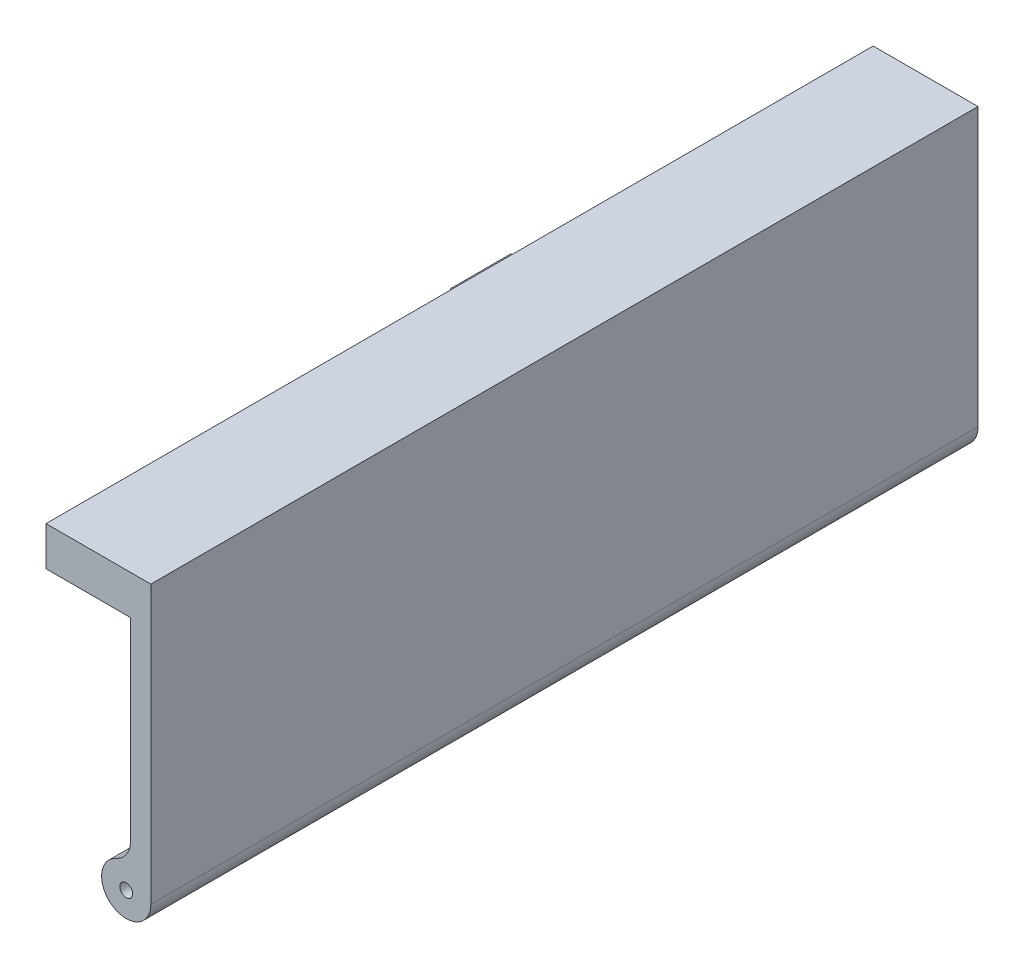
ISO-10303-21;
HEADER;
FILE_DESCRIPTION(('STEP AP214'),'2;1');
FILE_NAME('part.step','',(''),(''),'','','');
FILE_SCHEMA(('AUTOMOTIVE_DESIGN { 1 0 10303 214 1 1 1 1 }'));
ENDSEC;
DATA;
#1=APPLICATION_CONTEXT('core data for automotive mechanical design processes');
#2=APPLICATION_PROTOCOL_DEFINITION('international standard','automotive_design',2000,#1);
#3=PRODUCT_CONTEXT('',#1,'mechanical');
#4=PRODUCT('Part','Part','',(#3));
#5=PRODUCT_RELATED_PRODUCT_CATEGORY('part','',(#4));
#6=PRODUCT_DEFINITION_FORMATION('','',#4);
#7=PRODUCT_DEFINITION_CONTEXT('part definition',#1,'design');
#8=PRODUCT_DEFINITION('design','',#6,#7);
#9=PRODUCT_DEFINITION_SHAPE('','',#8);
#10=(LENGTH_UNIT() NAMED_UNIT(*) SI_UNIT(.MILLI.,.METRE.));
#11=(NAMED_UNIT(*) PLANE_ANGLE_UNIT() SI_UNIT($,.RADIAN.));
#12=(NAMED_UNIT(*) SI_UNIT($,.STERADIAN.) SOLID_ANGLE_UNIT());
#13=UNCERTAINTY_MEASURE_WITH_UNIT(LENGTH_MEASURE(1.E-05),#10,'distance_accuracy_value','');
#14=(GEOMETRIC_REPRESENTATION_CONTEXT(3) GLOBAL_UNCERTAINTY_ASSIGNED_CONTEXT((#13)) GLOBAL_UNIT_ASSIGNED_CONTEXT((#10,
#11,#12)) REPRESENTATION_CONTEXT('',''));
#15=CARTESIAN_POINT('',(0.,0.,0.));
#16=DIRECTION('',(0.,0.,1.));
#17=DIRECTION('',(1.,0.,0.));
#18=AXIS2_PLACEMENT_3D('',#15,#16,#17);
#19=CARTESIAN_POINT('',(-7.95,0.,0.));
#20=DIRECTION('',(1.,0.,0.));
#21=DIRECTION('',(0.,0.,-1.));
#22=AXIS2_PLACEMENT_3D('',#19,#20,#21);
#23=PLANE('',#22);
#24=DIRECTION('',(0.,1.,0.));
#25=VECTOR('',#24,1.);
#26=CARTESIAN_POINT('',(-7.95,23.619265905383,39.9228321400159));
#27=LINE('',#26,#25);
#28=CARTESIAN_POINT('',(-7.95,23.619265905383,39.9228321400159));
#29=VERTEX_POINT('',#28);
#30=CARTESIAN_POINT('',(-7.95,25.619265905383,39.9228321400159));
#31=VERTEX_POINT('',#30);
#32=EDGE_CURVE('E136',#29,#31,#27,.T.);
#33=ORIENTED_EDGE('',*,*,#32,.F.);
#34=DIRECTION('',(0.,0.,1.));
#35=VECTOR('',#34,1.);
#36=CARTESIAN_POINT('',(-7.95,23.619265905383,82.));
#37=LINE('',#36,#35);
#38=CARTESIAN_POINT('',(-7.95,23.619265905383,82.));
#39=VERTEX_POINT('',#38);
#40=EDGE_CURVE('E164',#29,#39,#37,.T.);
#41=ORIENTED_EDGE('',*,*,#40,.T.);
#42=DIRECTION('',(0.,1.,0.));
#43=VECTOR('',#42,1.);
#44=CARTESIAN_POINT('',(-7.95,27.5,82.));
#45=LINE('',#44,#43);
#46=CARTESIAN_POINT('',(-7.95,27.5,82.));
#47=VERTEX_POINT('',#46);
#48=EDGE_CURVE('E160',#39,#47,#45,.T.);
#49=ORIENTED_EDGE('',*,*,#48,.T.);
#50=DIRECTION('',(0.,0.,-1.));
#51=VECTOR('',#50,1.);
#52=CARTESIAN_POINT('',(-7.95,27.5,82.));
#53=LINE('',#52,#51);
#54=CARTESIAN_POINT('',(-7.95,27.5,0.));
#55=VERTEX_POINT('',#54);
#56=EDGE_CURVE('E163',#47,#55,#53,.T.);
#57=ORIENTED_EDGE('',*,*,#56,.T.);
#58=DIRECTION('',(0.,-1.,0.));
#59=VECTOR('',#58,1.);
#60=CARTESIAN_POINT('',(-7.95,27.5,0.));
#61=LINE('',#60,#59);
#62=CARTESIAN_POINT('',(-7.95,23.619265905383,0.));
#63=VERTEX_POINT('',#62);
#64=EDGE_CURVE('E167',#55,#63,#61,.T.);
#65=ORIENTED_EDGE('',*,*,#64,.T.);
#66=CARTESIAN_POINT('',(-7.95,23.619265905383,33.9228321400159));
#67=VERTEX_POINT('',#66);
#68=EDGE_CURVE('E169',#63,#67,#37,.T.);
#69=ORIENTED_EDGE('',*,*,#68,.T.);
#70=DIRECTION('',(0.,-1.,0.));
#71=VECTOR('',#70,1.);
#72=CARTESIAN_POINT('',(-7.95,23.619265905383,33.9228321400159));
#73=LINE('',#72,#71);
#74=CARTESIAN_POINT('',(-7.95,25.619265905383,33.9228321400159));
#75=VERTEX_POINT('',#74);
#76=EDGE_CURVE('E51',#75,#67,#73,.T.);
#77=ORIENTED_EDGE('',*,*,#76,.F.);
#78=DIRECTION('',(0.,0.,-1.));
#79=VECTOR('',#78,1.);
#80=CARTESIAN_POINT('',(-7.95,25.619265905383,39.9228321400159));
#81=LINE('',#80,#79);
#82=EDGE_CURVE('E152',#31,#75,#81,.T.);
#83=ORIENTED_EDGE('',*,*,#82,.F.);
#84=EDGE_LOOP('',(#33,#41,#49,#57,#65,#69,#77,#83));
#85=FACE_BOUND('',#84,.T.);
#86=ADVANCED_FACE('F47',(#85),#23,.F.);
#87=CARTESIAN_POINT('',(0.44,4.48998886412873,82.));
#88=DIRECTION('',(1.,0.,0.));
#89=DIRECTION('',(0.,0.,-1.));
#90=AXIS2_PLACEMENT_3D('',#87,#88,#89);
#91=PLANE('',#90);
#92=DIRECTION('',(0.,0.,1.));
#93=VECTOR('',#92,1.);
#94=CARTESIAN_POINT('',(0.44,23.619265905383,82.));
#95=LINE('',#94,#93);
#96=CARTESIAN_POINT('',(0.44,23.619265905383,0.));
#97=VERTEX_POINT('',#96);
#98=CARTESIAN_POINT('',(0.44,23.619265905383,82.));
#99=VERTEX_POINT('',#98);
#100=EDGE_CURVE('E149',#97,#99,#95,.T.);
#101=ORIENTED_EDGE('',*,*,#100,.F.);
#102=DIRECTION('',(0.,-1.,0.));
#103=VECTOR('',#102,1.);
#104=CARTESIAN_POINT('',(0.44,4.48998886412873,0.));
#105=LINE('',#104,#103);
#106=CARTESIAN_POINT('',(0.44,4.48998886412873,0.));
#107=VERTEX_POINT('',#106);
#108=EDGE_CURVE('E171',#97,#107,#105,.T.);
#109=ORIENTED_EDGE('',*,*,#108,.T.);
#110=DIRECTION('',(0.,0.,-1.));
#111=VECTOR('',#110,1.);
#112=CARTESIAN_POINT('',(0.44,4.48998886412873,82.));
#113=LINE('',#112,#111);
#114=CARTESIAN_POINT('',(0.44,4.48998886412873,82.));
#115=VERTEX_POINT('',#114);
#116=EDGE_CURVE('E191',#115,#107,#113,.T.);
#117=ORIENTED_EDGE('',*,*,#116,.F.);
#118=DIRECTION('',(0.,-1.,0.));
#119=VECTOR('',#118,1.);
#120=CARTESIAN_POINT('',(0.44,4.48998886412873,82.));
#121=LINE('',#120,#119);
#122=EDGE_CURVE('E177',#99,#115,#121,.T.);
#123=ORIENTED_EDGE('',*,*,#122,.F.);
#124=EDGE_LOOP('',(#101,#109,#117,#123));
#125=FACE_BOUND('',#124,.T.);
#126=ADVANCED_FACE('F249',(#125),#91,.F.);
#127=CARTESIAN_POINT('',(0.,0.,82.));
#128=DIRECTION('',(0.,0.,1.));
#129=DIRECTION('',(1.,0.,0.));
#130=AXIS2_PLACEMENT_3D('',#127,#128,#129);
#131=PLANE('',#130);
#132=CARTESIAN_POINT('',(0.,0.,82.));
#133=DIRECTION('',(0.,0.,1.));
#134=DIRECTION('',(1.,0.,0.));
#135=AXIS2_PLACEMENT_3D('',#132,#133,#134);
#136=CIRCLE('',#135,2.44);
#137=CARTESIAN_POINT('',(-1.01748987854251,2.21772729321338,82.));
#138=VERTEX_POINT('',#137);
#139=CARTESIAN_POINT('',(2.44,0.,82.));
#140=VERTEX_POINT('',#139);
#141=EDGE_CURVE('E197',#138,#140,#136,.T.);
#142=ORIENTED_EDGE('',*,*,#141,.T.);
#143=DIRECTION('',(0.,1.,0.));
#144=VECTOR('',#143,1.);
#145=CARTESIAN_POINT('',(2.44,0.,82.));
#146=LINE('',#145,#144);
#147=CARTESIAN_POINT('',(2.44,27.5,82.));
#148=VERTEX_POINT('',#147);
#149=EDGE_CURVE('E178',#140,#148,#146,.T.);
#150=ORIENTED_EDGE('',*,*,#149,.T.);
#151=DIRECTION('',(1.,0.,0.));
#152=VECTOR('',#151,1.);
#153=CARTESIAN_POINT('',(0.44,27.5,82.));
#154=LINE('',#153,#152);
#155=EDGE_CURVE('E181',#47,#148,#154,.T.);
#156=ORIENTED_EDGE('',*,*,#155,.F.);
#157=ORIENTED_EDGE('',*,*,#48,.F.);
#158=DIRECTION('',(1.,0.,0.));
#159=VECTOR('',#158,1.);
#160=CARTESIAN_POINT('',(-7.95,23.619265905383,82.));
#161=LINE('',#160,#159);
#162=EDGE_CURVE('E174',#39,#99,#161,.T.);
#163=ORIENTED_EDGE('',*,*,#162,.T.);
#164=ORIENTED_EDGE('',*,*,#122,.T.);
#165=CARTESIAN_POINT('',(-2.06,4.48998886412873,82.));
#166=DIRECTION('',(0.,0.,-1.));
#167=DIRECTION('',(-1.,0.,0.));
#168=AXIS2_PLACEMENT_3D('',#165,#166,#167);
#169=CIRCLE('',#168,2.5);
#170=EDGE_CURVE('E196',#115,#138,#169,.T.);
#171=ORIENTED_EDGE('',*,*,#170,.T.);
#172=EDGE_LOOP('',(#142,#150,#156,#157,#163,#164,#171));
#173=FACE_BOUND('',#172,.T.);
#174=CARTESIAN_POINT('',(0.,0.,82.));
#175=DIRECTION('',(0.,0.,1.));
#176=DIRECTION('',(1.,0.,0.));
#177=AXIS2_PLACEMENT_3D('',#174,#175,#176);
#178=CIRCLE('',#177,0.64);
#179=CARTESIAN_POINT('',(0.64,0.,82.));
#180=VERTEX_POINT('',#179);
#181=EDGE_CURVE('E188',#180,#180,#178,.T.);
#182=ORIENTED_EDGE('',*,*,#181,.F.);
#183=EDGE_LOOP('',(#182));
#184=FACE_BOUND('',#183,.T.);
#185=ADVANCED_FACE('F240',(#173,#184),#131,.T.);
#186=CARTESIAN_POINT('',(0.,0.,0.));
#187=DIRECTION('',(0.,0.,1.));
#188=DIRECTION('',(1.,0.,0.));
#189=AXIS2_PLACEMENT_3D('',#186,#187,#188);
#190=PLANE('',#189);
#191=CARTESIAN_POINT('',(0.,0.,0.));
#192=DIRECTION('',(0.,0.,1.));
#193=DIRECTION('',(1.,0.,0.));
#194=AXIS2_PLACEMENT_3D('',#191,#192,#193);
#195=CIRCLE('',#194,2.44);
#196=CARTESIAN_POINT('',(-1.01748987854251,2.21772729321338,0.));
#197=VERTEX_POINT('',#196);
#198=CARTESIAN_POINT('',(2.44,0.,0.));
#199=VERTEX_POINT('',#198);
#200=EDGE_CURVE('E195',#197,#199,#195,.T.);
#201=ORIENTED_EDGE('',*,*,#200,.F.);
#202=CARTESIAN_POINT('',(-2.06,4.48998886412873,0.));
#203=DIRECTION('',(0.,0.,-1.));
#204=DIRECTION('',(-1.,0.,0.));
#205=AXIS2_PLACEMENT_3D('',#202,#203,#204);
#206=CIRCLE('',#205,2.5);
#207=EDGE_CURVE('E210',#107,#197,#206,.T.);
#208=ORIENTED_EDGE('',*,*,#207,.F.);
#209=ORIENTED_EDGE('',*,*,#108,.F.);
#210=DIRECTION('',(1.,0.,0.));
#211=VECTOR('',#210,1.);
#212=CARTESIAN_POINT('',(-7.95,23.619265905383,0.));
#213=LINE('',#212,#211);
#214=EDGE_CURVE('E173',#63,#97,#213,.T.);
#215=ORIENTED_EDGE('',*,*,#214,.F.);
#216=ORIENTED_EDGE('',*,*,#64,.F.);
#217=DIRECTION('',(-1.,0.,0.));
#218=VECTOR('',#217,1.);
#219=CARTESIAN_POINT('',(0.44,27.5,0.));
#220=LINE('',#219,#218);
#221=CARTESIAN_POINT('',(2.44,27.5,0.));
#222=VERTEX_POINT('',#221);
#223=EDGE_CURVE('E184',#222,#55,#220,.T.);
#224=ORIENTED_EDGE('',*,*,#223,.F.);
#225=DIRECTION('',(0.,1.,0.));
#226=VECTOR('',#225,1.);
#227=CARTESIAN_POINT('',(2.44,0.,0.));
#228=LINE('',#227,#226);
#229=EDGE_CURVE('E206',#199,#222,#228,.T.);
#230=ORIENTED_EDGE('',*,*,#229,.F.);
#231=EDGE_LOOP('',(#201,#208,#209,#215,#216,#224,#230));
#232=FACE_BOUND('',#231,.T.);
#233=CARTESIAN_POINT('',(0.,0.,0.));
#234=DIRECTION('',(0.,0.,1.));
#235=DIRECTION('',(1.,0.,0.));
#236=AXIS2_PLACEMENT_3D('',#233,#234,#235);
#237=CIRCLE('',#236,0.64);
#238=CARTESIAN_POINT('',(0.64,0.,0.));
#239=VERTEX_POINT('',#238);
#240=EDGE_CURVE('E192',#239,#239,#237,.T.);
#241=ORIENTED_EDGE('',*,*,#240,.T.);
#242=EDGE_LOOP('',(#241));
#243=FACE_BOUND('',#242,.T.);
#244=ADVANCED_FACE('F228',(#232,#243),#190,.F.);
#245=CARTESIAN_POINT('',(0.,0.,82.));
#246=DIRECTION('',(0.,0.,-1.));
#247=DIRECTION('',(-1.,0.,0.));
#248=AXIS2_PLACEMENT_3D('',#245,#246,#247);
#249=CYLINDRICAL_SURFACE('',#248,2.44);
#250=ORIENTED_EDGE('',*,*,#200,.T.);
#251=DIRECTION('',(0.,0.,-1.));
#252=VECTOR('',#251,1.);
#253=CARTESIAN_POINT('',(2.44,0.,82.));
#254=LINE('',#253,#252);
#255=EDGE_CURVE('E208',#140,#199,#254,.T.);
#256=ORIENTED_EDGE('',*,*,#255,.F.);
#257=ORIENTED_EDGE('',*,*,#141,.F.);
#258=DIRECTION('',(0.,0.,-1.));
#259=VECTOR('',#258,1.);
#260=CARTESIAN_POINT('',(-1.01748987854251,2.21772729321338,82.));
#261=LINE('',#260,#259);
#262=EDGE_CURVE('E205',#138,#197,#261,.T.);
#263=ORIENTED_EDGE('',*,*,#262,.T.);
#264=EDGE_LOOP('',(#250,#256,#257,#263));
#265=FACE_BOUND('',#264,.T.);
#266=ADVANCED_FACE('F224',(#265),#249,.T.);
#267=CARTESIAN_POINT('',(2.44,0.,82.));
#268=DIRECTION('',(-1.,0.,0.));
#269=DIRECTION('',(0.,0.,1.));
#270=AXIS2_PLACEMENT_3D('',#267,#268,#269);
#271=PLANE('',#270);
#272=ORIENTED_EDGE('',*,*,#229,.T.);
#273=DIRECTION('',(0.,0.,-1.));
#274=VECTOR('',#273,1.);
#275=CARTESIAN_POINT('',(2.44,27.5,82.));
#276=LINE('',#275,#274);
#277=EDGE_CURVE('E180',#148,#222,#276,.T.);
#278=ORIENTED_EDGE('',*,*,#277,.F.);
#279=ORIENTED_EDGE('',*,*,#149,.F.);
#280=ORIENTED_EDGE('',*,*,#255,.T.);
#281=EDGE_LOOP('',(#272,#278,#279,#280));
#282=FACE_BOUND('',#281,.T.);
#283=ADVANCED_FACE('F219',(#282),#271,.F.);
#284=CARTESIAN_POINT('',(-2.06,4.48998886412873,82.));
#285=DIRECTION('',(0.,0.,-1.));
#286=DIRECTION('',(-1.,0.,0.));
#287=AXIS2_PLACEMENT_3D('',#284,#285,#286);
#288=CYLINDRICAL_SURFACE('',#287,2.5);
#289=ORIENTED_EDGE('',*,*,#207,.T.);
#290=ORIENTED_EDGE('',*,*,#262,.F.);
#291=ORIENTED_EDGE('',*,*,#170,.F.);
#292=ORIENTED_EDGE('',*,*,#116,.T.);
#293=EDGE_LOOP('',(#289,#290,#291,#292));
#294=FACE_BOUND('',#293,.T.);
#295=ADVANCED_FACE('F246',(#294),#288,.F.);
#296=CARTESIAN_POINT('',(0.,0.,82.));
#297=DIRECTION('',(0.,0.,-1.));
#298=DIRECTION('',(-1.,0.,0.));
#299=AXIS2_PLACEMENT_3D('',#296,#297,#298);
#300=CYLINDRICAL_SURFACE('',#299,0.64);
#301=ORIENTED_EDGE('',*,*,#181,.T.);
#302=EDGE_LOOP('',(#301));
#303=FACE_BOUND('',#302,.T.);
#304=ORIENTED_EDGE('',*,*,#240,.F.);
#305=EDGE_LOOP('',(#304));
#306=FACE_BOUND('',#305,.T.);
#307=ADVANCED_FACE('F271',(#303,#306),#300,.F.);
#308=CARTESIAN_POINT('',(0.,27.5,0.));
#309=DIRECTION('',(0.,-1.,0.));
#310=DIRECTION('',(0.,0.,-1.));
#311=AXIS2_PLACEMENT_3D('',#308,#309,#310);
#312=PLANE('',#311);
#313=ORIENTED_EDGE('',*,*,#223,.T.);
#314=ORIENTED_EDGE('',*,*,#56,.F.);
#315=ORIENTED_EDGE('',*,*,#155,.T.);
#316=ORIENTED_EDGE('',*,*,#277,.T.);
#317=EDGE_LOOP('',(#313,#314,#315,#316));
#318=FACE_BOUND('',#317,.T.);
#319=ADVANCED_FACE('F236',(#318),#312,.F.);
#320=CARTESIAN_POINT('',(-7.95,23.619265905383,82.));
#321=DIRECTION('',(0.,1.,0.));
#322=DIRECTION('',(0.,0.,1.));
#323=AXIS2_PLACEMENT_3D('',#320,#321,#322);
#324=PLANE('',#323);
#325=ORIENTED_EDGE('',*,*,#40,.F.);
#326=DIRECTION('',(-1.,0.,0.));
#327=VECTOR('',#326,1.);
#328=CARTESIAN_POINT('',(-7.95,23.619265905383,39.9228321400159));
#329=LINE('',#328,#327);
#330=CARTESIAN_POINT('',(-5.95,23.619265905383,39.9228321400159));
#331=VERTEX_POINT('',#330);
#332=EDGE_CURVE('E146',#331,#29,#329,.T.);
#333=ORIENTED_EDGE('',*,*,#332,.F.);
#334=DIRECTION('',(0.,0.,1.));
#335=VECTOR('',#334,1.);
#336=CARTESIAN_POINT('',(-5.95,23.619265905383,33.9228321400159));
#337=LINE('',#336,#335);
#338=CARTESIAN_POINT('',(-5.95,23.619265905383,33.9228321400159));
#339=VERTEX_POINT('',#338);
#340=EDGE_CURVE('E132',#339,#331,#337,.T.);
#341=ORIENTED_EDGE('',*,*,#340,.F.);
#342=DIRECTION('',(1.,0.,0.));
#343=VECTOR('',#342,1.);
#344=CARTESIAN_POINT('',(-7.95,23.619265905383,33.9228321400159));
#345=LINE('',#344,#343);
#346=EDGE_CURVE('E155',#67,#339,#345,.T.);
#347=ORIENTED_EDGE('',*,*,#346,.F.);
#348=ORIENTED_EDGE('',*,*,#68,.F.);
#349=ORIENTED_EDGE('',*,*,#214,.T.);
#350=ORIENTED_EDGE('',*,*,#100,.T.);
#351=ORIENTED_EDGE('',*,*,#162,.F.);
#352=EDGE_LOOP('',(#325,#333,#341,#347,#348,#349,#350,#351));
#353=FACE_BOUND('',#352,.T.);
#354=ADVANCED_FACE('F49',(#353),#324,.F.);
#355=CARTESIAN_POINT('',(-7.95,25.619265905383,39.9228321400159));
#356=DIRECTION('',(0.,0.,1.));
#357=DIRECTION('',(1.,0.,0.));
#358=AXIS2_PLACEMENT_3D('',#355,#356,#357);
#359=PLANE('',#358);
#360=ORIENTED_EDGE('',*,*,#332,.T.);
#361=ORIENTED_EDGE('',*,*,#32,.T.);
#362=DIRECTION('',(-1.,0.,0.));
#363=VECTOR('',#362,1.);
#364=CARTESIAN_POINT('',(-7.95,25.619265905383,39.9228321400159));
#365=LINE('',#364,#363);
#366=CARTESIAN_POINT('',(-5.95,25.619265905383,39.9228321400159));
#367=VERTEX_POINT('',#366);
#368=EDGE_CURVE('E12',#367,#31,#365,.T.);
#369=ORIENTED_EDGE('',*,*,#368,.F.);
#370=DIRECTION('',(0.,-1.,0.));
#371=VECTOR('',#370,1.);
#372=CARTESIAN_POINT('',(-5.95,25.619265905383,39.9228321400159));
#373=LINE('',#372,#371);
#374=EDGE_CURVE('E127',#367,#331,#373,.T.);
#375=ORIENTED_EDGE('',*,*,#374,.T.);
#376=EDGE_LOOP('',(#360,#361,#369,#375));
#377=FACE_BOUND('',#376,.T.);
#378=ADVANCED_FACE('F144',(#377),#359,.F.);
#379=CARTESIAN_POINT('',(-5.95,25.619265905383,33.9228321400159));
#380=DIRECTION('',(1.,0.,0.));
#381=DIRECTION('',(0.,0.,-1.));
#382=AXIS2_PLACEMENT_3D('',#379,#380,#381);
#383=PLANE('',#382);
#384=ORIENTED_EDGE('',*,*,#340,.T.);
#385=ORIENTED_EDGE('',*,*,#374,.F.);
#386=DIRECTION('',(0.,0.,1.));
#387=VECTOR('',#386,1.);
#388=CARTESIAN_POINT('',(-5.95,25.619265905383,33.9228321400159));
#389=LINE('',#388,#387);
#390=CARTESIAN_POINT('',(-5.95,25.619265905383,33.9228321400159));
#391=VERTEX_POINT('',#390);
#392=EDGE_CURVE('E57',#391,#367,#389,.T.);
#393=ORIENTED_EDGE('',*,*,#392,.F.);
#394=DIRECTION('',(0.,-1.,0.));
#395=VECTOR('',#394,1.);
#396=CARTESIAN_POINT('',(-5.95,25.619265905383,33.9228321400159));
#397=LINE('',#396,#395);
#398=EDGE_CURVE('E157',#391,#339,#397,.T.);
#399=ORIENTED_EDGE('',*,*,#398,.T.);
#400=EDGE_LOOP('',(#384,#385,#393,#399));
#401=FACE_BOUND('',#400,.T.);
#402=ADVANCED_FACE('F129',(#401),#383,.F.);
#403=CARTESIAN_POINT('',(-7.95,25.619265905383,33.9228321400159));
#404=DIRECTION('',(0.,0.,-1.));
#405=DIRECTION('',(-1.,0.,0.));
#406=AXIS2_PLACEMENT_3D('',#403,#404,#405);
#407=PLANE('',#406);
#408=ORIENTED_EDGE('',*,*,#346,.T.);
#409=ORIENTED_EDGE('',*,*,#398,.F.);
#410=DIRECTION('',(1.,0.,0.));
#411=VECTOR('',#410,1.);
#412=CARTESIAN_POINT('',(-7.95,25.619265905383,33.9228321400159));
#413=LINE('',#412,#411);
#414=EDGE_CURVE('E142',#75,#391,#413,.T.);
#415=ORIENTED_EDGE('',*,*,#414,.F.);
#416=ORIENTED_EDGE('',*,*,#76,.T.);
#417=EDGE_LOOP('',(#408,#409,#415,#416));
#418=FACE_BOUND('',#417,.T.);
#419=ADVANCED_FACE('F254',(#418),#407,.F.);
#420=CARTESIAN_POINT('',(0.,25.619265905383,0.));
#421=DIRECTION('',(0.,1.,0.));
#422=DIRECTION('',(0.,0.,1.));
#423=AXIS2_PLACEMENT_3D('',#420,#421,#422);
#424=PLANE('',#423);
#425=ORIENTED_EDGE('',*,*,#82,.T.);
#426=ORIENTED_EDGE('',*,*,#414,.T.);
#427=ORIENTED_EDGE('',*,*,#392,.T.);
#428=ORIENTED_EDGE('',*,*,#368,.T.);
#429=EDGE_LOOP('',(#425,#426,#427,#428));
#430=FACE_BOUND('',#429,.T.);
#431=ADVANCED_FACE('F140',(#430),#424,.F.);
#432=CLOSED_SHELL('',(#86,#126,#185,#244,#266,#283,#295,#307,#319,#354,#378,#402,#419,#431));
#433=MANIFOLD_SOLID_BREP('B2',#432);
#434=CARTESIAN_POINT('',(-9.95,0.,0.));
#435=DIRECTION('',(-1.,0.,0.));
#436=DIRECTION('',(0.,0.,1.));
#437=AXIS2_PLACEMENT_3D('',#434,#435,#436);
#438=PLANE('',#437);
#439=DIRECTION('',(0.,1.,0.));
#440=VECTOR('',#439,1.);
#441=CARTESIAN_POINT('',(-9.95,23.619265905383,39.9228321400159));
#442=LINE('',#441,#440);
#443=CARTESIAN_POINT('',(-9.95,23.619265905383,39.9228321400159));
#444=VERTEX_POINT('',#443);
#445=CARTESIAN_POINT('',(-9.95,25.619265905383,39.9228321400159));
#446=VERTEX_POINT('',#445);
#447=EDGE_CURVE('E454',#444,#446,#442,.T.);
#448=ORIENTED_EDGE('',*,*,#447,.T.);
#449=DIRECTION('',(0.,0.,-1.));
#450=VECTOR('',#449,1.);
#451=CARTESIAN_POINT('',(-9.95,25.619265905383,39.9228321400159));
#452=LINE('',#451,#450);
#453=CARTESIAN_POINT('',(-9.95,25.619265905383,33.9228321400159));
#454=VERTEX_POINT('',#453);
#455=EDGE_CURVE('E480',#446,#454,#452,.T.);
#456=ORIENTED_EDGE('',*,*,#455,.T.);
#457=DIRECTION('',(0.,-1.,0.));
#458=VECTOR('',#457,1.);
#459=CARTESIAN_POINT('',(-9.95,23.619265905383,33.9228321400159));
#460=LINE('',#459,#458);
#461=CARTESIAN_POINT('',(-9.95,23.619265905383,33.9228321400159));
#462=VERTEX_POINT('',#461);
#463=EDGE_CURVE('E466',#454,#462,#460,.T.);
#464=ORIENTED_EDGE('',*,*,#463,.T.);
#465=DIRECTION('',(0.,0.,1.));
#466=VECTOR('',#465,1.);
#467=CARTESIAN_POINT('',(-9.95,23.619265905383,39.9228321400159));
#468=LINE('',#467,#466);
#469=EDGE_CURVE('E475',#462,#444,#468,.T.);
#470=ORIENTED_EDGE('',*,*,#469,.T.);
#471=EDGE_LOOP('',(#448,#456,#464,#470));
#472=FACE_BOUND('',#471,.T.);
#473=ADVANCED_FACE('F397',(#472),#438,.T.);
#474=CARTESIAN_POINT('',(-9.95,23.619265905383,33.9228321400159));
#475=DIRECTION('',(0.,0.,1.));
#476=DIRECTION('',(1.,0.,0.));
#477=AXIS2_PLACEMENT_3D('',#474,#475,#476);
#478=PLANE('',#477);
#479=DIRECTION('',(0.,-1.,0.));
#480=VECTOR('',#479,1.);
#481=CARTESIAN_POINT('',(-7.95,23.619265905383,33.9228321400159));
#482=LINE('',#481,#480);
#483=CARTESIAN_POINT('',(-7.95,25.619265905383,33.9228321400159));
#484=VERTEX_POINT('',#483);
#485=CARTESIAN_POINT('',(-7.95,24.119265905383,33.9228321400159));
#486=VERTEX_POINT('',#485);
#487=EDGE_CURVE('E445',#484,#486,#482,.T.);
#488=ORIENTED_EDGE('',*,*,#487,.T.);
#489=DIRECTION('',(0.70710678118655,0.707106781186545,0.));
#490=VECTOR('',#489,1.);
#491=CARTESIAN_POINT('',(-7.95,24.119265905383,33.9228321400159));
#492=LINE('',#491,#490);
#493=CARTESIAN_POINT('',(-8.45,23.619265905383,33.9228321400159));
#494=VERTEX_POINT('',#493);
#495=EDGE_CURVE('E420',#486,#494,#492,.F.);
#496=ORIENTED_EDGE('',*,*,#495,.T.);
#497=DIRECTION('',(1.,0.,0.));
#498=VECTOR('',#497,1.);
#499=CARTESIAN_POINT('',(-9.95,23.619265905383,33.9228321400159));
#500=LINE('',#499,#498);
#501=EDGE_CURVE('E467',#462,#494,#500,.T.);
#502=ORIENTED_EDGE('',*,*,#501,.F.);
#503=ORIENTED_EDGE('',*,*,#463,.F.);
#504=DIRECTION('',(1.,0.,0.));
#505=VECTOR('',#504,1.);
#506=CARTESIAN_POINT('',(-9.95,25.619265905383,33.9228321400159));
#507=LINE('',#506,#505);
#508=EDGE_CURVE('E459',#454,#484,#507,.T.);
#509=ORIENTED_EDGE('',*,*,#508,.T.);
#510=EDGE_LOOP('',(#488,#496,#502,#503,#509));
#511=FACE_BOUND('',#510,.T.);
#512=ADVANCED_FACE('F465',(#511),#478,.F.);
#513=CARTESIAN_POINT('',(-9.95,25.619265905383,39.9228321400159));
#514=DIRECTION('',(0.,-1.,0.));
#515=DIRECTION('',(0.,0.,-1.));
#516=AXIS2_PLACEMENT_3D('',#513,#514,#515);
#517=PLANE('',#516);
#518=DIRECTION('',(0.,0.,-1.));
#519=VECTOR('',#518,1.);
#520=CARTESIAN_POINT('',(-7.95,25.619265905383,39.9228321400159));
#521=LINE('',#520,#519);
#522=CARTESIAN_POINT('',(-7.95,25.619265905383,39.9228321400159));
#523=VERTEX_POINT('',#522);
#524=EDGE_CURVE('E449',#523,#484,#521,.T.);
#525=ORIENTED_EDGE('',*,*,#524,.T.);
#526=ORIENTED_EDGE('',*,*,#508,.F.);
#527=ORIENTED_EDGE('',*,*,#455,.F.);
#528=DIRECTION('',(1.,0.,0.));
#529=VECTOR('',#528,1.);
#530=CARTESIAN_POINT('',(-9.95,25.619265905383,39.9228321400159));
#531=LINE('',#530,#529);
#532=EDGE_CURVE('E462',#446,#523,#531,.T.);
#533=ORIENTED_EDGE('',*,*,#532,.T.);
#534=EDGE_LOOP('',(#525,#526,#527,#533));
#535=FACE_BOUND('',#534,.T.);
#536=ADVANCED_FACE('F458',(#535),#517,.F.);
#537=CARTESIAN_POINT('',(-9.95,23.619265905383,39.9228321400159));
#538=DIRECTION('',(0.,0.,-1.));
#539=DIRECTION('',(-1.,0.,0.));
#540=AXIS2_PLACEMENT_3D('',#537,#538,#539);
#541=PLANE('',#540);
#542=DIRECTION('',(1.,0.,0.));
#543=VECTOR('',#542,1.);
#544=CARTESIAN_POINT('',(-9.95,23.619265905383,39.9228321400159));
#545=LINE('',#544,#543);
#546=CARTESIAN_POINT('',(-8.45,23.619265905383,39.9228321400159));
#547=VERTEX_POINT('',#546);
#548=EDGE_CURVE('E470',#444,#547,#545,.T.);
#549=ORIENTED_EDGE('',*,*,#548,.T.);
#550=DIRECTION('',(-0.70710678118655,-0.707106781186545,0.));
#551=VECTOR('',#550,1.);
#552=CARTESIAN_POINT('',(-7.95,24.119265905383,39.9228321400159));
#553=LINE('',#552,#551);
#554=CARTESIAN_POINT('',(-7.95,24.119265905383,39.9228321400159));
#555=VERTEX_POINT('',#554);
#556=EDGE_CURVE('E45',#547,#555,#553,.F.);
#557=ORIENTED_EDGE('',*,*,#556,.T.);
#558=DIRECTION('',(0.,1.,0.));
#559=VECTOR('',#558,1.);
#560=CARTESIAN_POINT('',(-7.95,23.619265905383,39.9228321400159));
#561=LINE('',#560,#559);
#562=EDGE_CURVE('E463',#555,#523,#561,.T.);
#563=ORIENTED_EDGE('',*,*,#562,.T.);
#564=ORIENTED_EDGE('',*,*,#532,.F.);
#565=ORIENTED_EDGE('',*,*,#447,.F.);
#566=EDGE_LOOP('',(#549,#557,#563,#564,#565));
#567=FACE_BOUND('',#566,.T.);
#568=ADVANCED_FACE('F487',(#567),#541,.F.);
#569=CARTESIAN_POINT('',(-7.95,23.619265905383,82.));
#570=DIRECTION('',(0.,1.,0.));
#571=DIRECTION('',(0.,0.,1.));
#572=AXIS2_PLACEMENT_3D('',#569,#570,#571);
#573=PLANE('',#572);
#574=ORIENTED_EDGE('',*,*,#501,.T.);
#575=DIRECTION('',(0.,0.,1.));
#576=VECTOR('',#575,1.);
#577=CARTESIAN_POINT('',(-8.45,23.619265905383,82.));
#578=LINE('',#577,#576);
#579=EDGE_CURVE('E406',#494,#547,#578,.T.);
#580=ORIENTED_EDGE('',*,*,#579,.T.);
#581=ORIENTED_EDGE('',*,*,#548,.F.);
#582=ORIENTED_EDGE('',*,*,#469,.F.);
#583=EDGE_LOOP('',(#574,#580,#581,#582));
#584=FACE_BOUND('',#583,.T.);
#585=ADVANCED_FACE('F494',(#584),#573,.F.);
#586=CARTESIAN_POINT('',(-7.95,25.619265905383,33.9228321400159));
#587=DIRECTION('',(-1.,0.,0.));
#588=DIRECTION('',(0.,0.,1.));
#589=AXIS2_PLACEMENT_3D('',#586,#587,#588);
#590=PLANE('',#589);
#591=ORIENTED_EDGE('',*,*,#562,.F.);
#592=DIRECTION('',(0.,0.,-1.));
#593=VECTOR('',#592,1.);
#594=CARTESIAN_POINT('',(-7.95,24.119265905383,33.9228321400159));
#595=LINE('',#594,#593);
#596=EDGE_CURVE('E452',#555,#486,#595,.T.);
#597=ORIENTED_EDGE('',*,*,#596,.T.);
#598=ORIENTED_EDGE('',*,*,#487,.F.);
#599=ORIENTED_EDGE('',*,*,#524,.F.);
#600=EDGE_LOOP('',(#591,#597,#598,#599));
#601=FACE_BOUND('',#600,.T.);
#602=ADVANCED_FACE('F448',(#601),#590,.F.);
#603=CARTESIAN_POINT('',(-7.95,24.119265905383,33.9228321400159));
#604=DIRECTION('',(-0.707106781186545,0.70710678118655,0.));
#605=DIRECTION('',(0.,0.,-1.));
#606=AXIS2_PLACEMENT_3D('',#603,#604,#605);
#607=PLANE('',#606);
#608=ORIENTED_EDGE('',*,*,#556,.F.);
#609=ORIENTED_EDGE('',*,*,#579,.F.);
#610=ORIENTED_EDGE('',*,*,#495,.F.);
#611=ORIENTED_EDGE('',*,*,#596,.F.);
#612=EDGE_LOOP('',(#608,#609,#610,#611));
#613=FACE_BOUND('',#612,.T.);
#614=ADVANCED_FACE('F400',(#613),#607,.F.);
#615=CLOSED_SHELL('',(#473,#512,#536,#568,#585,#602,#614));
#616=MANIFOLD_SOLID_BREP('B6',#615);
#617=ADVANCED_BREP_SHAPE_REPRESENTATION('',(#18,#433,#616),#14);
#618=SHAPE_DEFINITION_REPRESENTATION(#9,#617);
ENDSEC;
END-ISO-10303-21;
